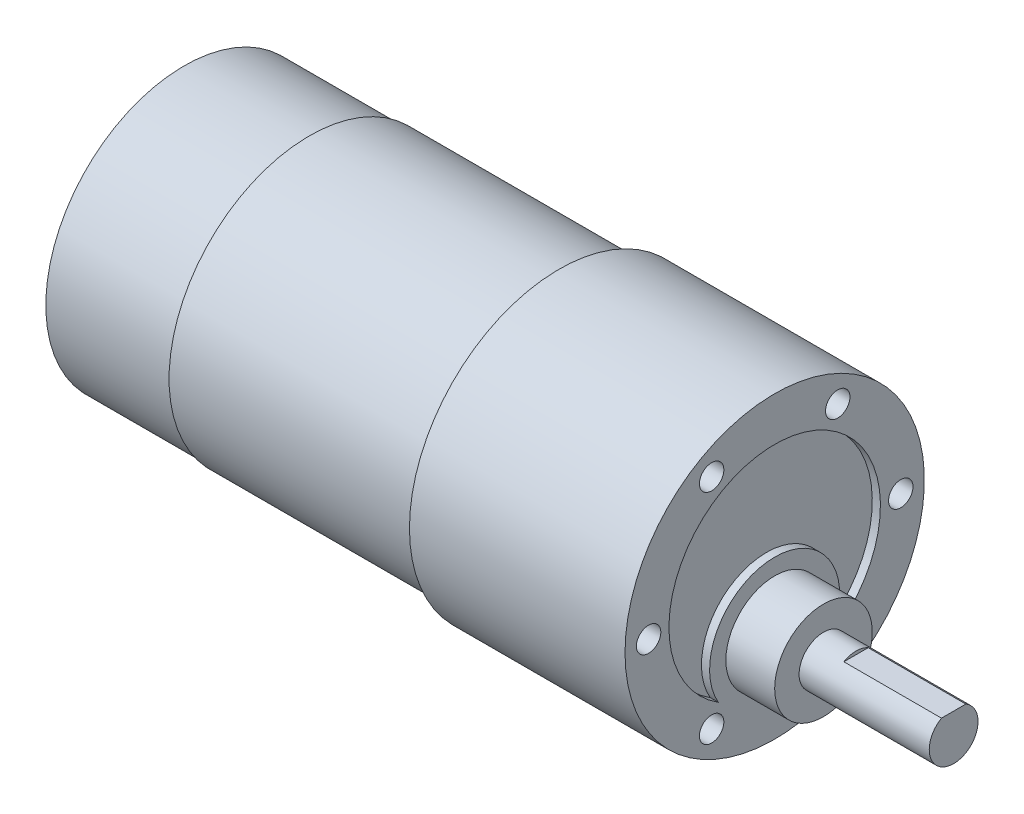
ISO-10303-21;
HEADER;
FILE_DESCRIPTION(('STEP AP214'),'2;1');
FILE_NAME('part.step','',(''),(''),'','','');
FILE_SCHEMA(('AUTOMOTIVE_DESIGN { 1 0 10303 214 1 1 1 1 }'));
ENDSEC;
DATA;
#1=APPLICATION_CONTEXT('core data for automotive mechanical design processes');
#2=APPLICATION_PROTOCOL_DEFINITION('international standard','automotive_design',2000,#1);
#3=PRODUCT_CONTEXT('',#1,'mechanical');
#4=PRODUCT('Part','Part','',(#3));
#5=PRODUCT_RELATED_PRODUCT_CATEGORY('part','',(#4));
#6=PRODUCT_DEFINITION_FORMATION('','',#4);
#7=PRODUCT_DEFINITION_CONTEXT('part definition',#1,'design');
#8=PRODUCT_DEFINITION('design','',#6,#7);
#9=PRODUCT_DEFINITION_SHAPE('','',#8);
#10=(LENGTH_UNIT() NAMED_UNIT(*) SI_UNIT(.MILLI.,.METRE.));
#11=(NAMED_UNIT(*) PLANE_ANGLE_UNIT() SI_UNIT($,.RADIAN.));
#12=(NAMED_UNIT(*) SI_UNIT($,.STERADIAN.) SOLID_ANGLE_UNIT());
#13=UNCERTAINTY_MEASURE_WITH_UNIT(LENGTH_MEASURE(1.E-05),#10,'distance_accuracy_value','');
#14=(GEOMETRIC_REPRESENTATION_CONTEXT(3) GLOBAL_UNCERTAINTY_ASSIGNED_CONTEXT((#13)) GLOBAL_UNIT_ASSIGNED_CONTEXT((#10,
#11,#12)) REPRESENTATION_CONTEXT('',''));
#15=CARTESIAN_POINT('',(0.,0.,0.));
#16=DIRECTION('',(0.,0.,1.));
#17=DIRECTION('',(1.,0.,0.));
#18=AXIS2_PLACEMENT_3D('',#15,#16,#17);
#19=CARTESIAN_POINT('',(-26.5,0.,0.));
#20=DIRECTION('',(1.,0.,0.));
#21=DIRECTION('',(0.,1.,0.));
#22=AXIS2_PLACEMENT_3D('',#19,#20,#21);
#23=PLANE('',#22);
#24=CARTESIAN_POINT('',(-26.5,0.,0.));
#25=DIRECTION('',(1.,0.,0.));
#26=DIRECTION('',(0.,0.,1.));
#27=AXIS2_PLACEMENT_3D('',#24,#25,#26);
#28=CIRCLE('',#27,17.25);
#29=CARTESIAN_POINT('',(-26.5,0.,-17.25));
#30=VERTEX_POINT('',#29);
#31=EDGE_CURVE('E207',#30,#30,#28,.T.);
#32=ORIENTED_EDGE('',*,*,#31,.T.);
#33=EDGE_LOOP('',(#32));
#34=FACE_BOUND('',#33,.T.);
#35=CARTESIAN_POINT('',(-26.5,0.,0.));
#36=DIRECTION('',(-1.,0.,0.));
#37=DIRECTION('',(0.,0.,-1.));
#38=AXIS2_PLACEMENT_3D('',#35,#36,#37);
#39=CIRCLE('',#38,18.4);
#40=CARTESIAN_POINT('',(-26.5,0.,18.4));
#41=VERTEX_POINT('',#40);
#42=EDGE_CURVE('E238',#41,#41,#39,.T.);
#43=ORIENTED_EDGE('',*,*,#42,.T.);
#44=EDGE_LOOP('',(#43));
#45=FACE_BOUND('',#44,.T.);
#46=ADVANCED_FACE('F16',(#34,#45),#23,.F.);
#47=CARTESIAN_POINT('',(0.,0.,0.));
#48=DIRECTION('',(1.,0.,0.));
#49=DIRECTION('',(0.,1.,0.));
#50=AXIS2_PLACEMENT_3D('',#47,#48,#49);
#51=PLANE('',#50);
#52=CARTESIAN_POINT('',(0.,-7.00000010430813,0.));
#53=DIRECTION('',(-1.,0.,0.));
#54=DIRECTION('',(0.,0.,-1.));
#55=AXIS2_PLACEMENT_3D('',#52,#53,#54);
#56=CIRCLE('',#55,6.);
#57=CARTESIAN_POINT('',(0.,-7.00000010430813,6.));
#58=VERTEX_POINT('',#57);
#59=EDGE_CURVE('E215',#58,#58,#56,.T.);
#60=ORIENTED_EDGE('',*,*,#59,.T.);
#61=EDGE_LOOP('',(#60));
#62=FACE_BOUND('',#61,.T.);
#63=CARTESIAN_POINT('',(0.,-13.4233937586588,7.75));
#64=DIRECTION('',(-1.,0.,0.));
#65=DIRECTION('',(0.,0.,-1.));
#66=AXIS2_PLACEMENT_3D('',#63,#64,#65);
#67=CIRCLE('',#66,1.5);
#68=CARTESIAN_POINT('',(0.,-13.4233937586588,9.25));
#69=VERTEX_POINT('',#68);
#70=EDGE_CURVE('E125',#69,#69,#67,.T.);
#71=ORIENTED_EDGE('',*,*,#70,.T.);
#72=EDGE_LOOP('',(#71));
#73=FACE_BOUND('',#72,.T.);
#74=CARTESIAN_POINT('',(0.,0.,15.5));
#75=DIRECTION('',(-1.,0.,0.));
#76=DIRECTION('',(0.,0.,-1.));
#77=AXIS2_PLACEMENT_3D('',#74,#75,#76);
#78=CIRCLE('',#77,1.5);
#79=CARTESIAN_POINT('',(0.,0.,17.));
#80=VERTEX_POINT('',#79);
#81=EDGE_CURVE('E347',#80,#80,#78,.T.);
#82=ORIENTED_EDGE('',*,*,#81,.T.);
#83=EDGE_LOOP('',(#82));
#84=FACE_BOUND('',#83,.T.);
#85=CARTESIAN_POINT('',(0.,13.4233937586588,-7.75));
#86=DIRECTION('',(-1.,0.,0.));
#87=DIRECTION('',(0.,0.,-1.));
#88=AXIS2_PLACEMENT_3D('',#85,#86,#87);
#89=CIRCLE('',#88,1.5);
#90=CARTESIAN_POINT('',(0.,13.4233937586588,-6.25));
#91=VERTEX_POINT('',#90);
#92=EDGE_CURVE('E181',#91,#91,#89,.T.);
#93=ORIENTED_EDGE('',*,*,#92,.T.);
#94=EDGE_LOOP('',(#93));
#95=FACE_BOUND('',#94,.T.);
#96=CARTESIAN_POINT('',(0.,-13.4233937586588,-7.75));
#97=DIRECTION('',(-1.,0.,0.));
#98=DIRECTION('',(0.,0.,-1.));
#99=AXIS2_PLACEMENT_3D('',#96,#97,#98);
#100=CIRCLE('',#99,1.5);
#101=CARTESIAN_POINT('',(0.,-13.4233937586588,-6.25));
#102=VERTEX_POINT('',#101);
#103=EDGE_CURVE('E162',#102,#102,#100,.T.);
#104=ORIENTED_EDGE('',*,*,#103,.T.);
#105=EDGE_LOOP('',(#104));
#106=FACE_BOUND('',#105,.T.);
#107=CARTESIAN_POINT('',(0.,13.4233937586588,7.75));
#108=DIRECTION('',(-1.,0.,0.));
#109=DIRECTION('',(0.,0.,-1.));
#110=AXIS2_PLACEMENT_3D('',#107,#108,#109);
#111=CIRCLE('',#110,1.5);
#112=CARTESIAN_POINT('',(0.,13.4233937586588,9.25));
#113=VERTEX_POINT('',#112);
#114=EDGE_CURVE('E239',#113,#113,#111,.T.);
#115=ORIENTED_EDGE('',*,*,#114,.T.);
#116=EDGE_LOOP('',(#115));
#117=FACE_BOUND('',#116,.T.);
#118=CARTESIAN_POINT('',(0.,0.,-15.5));
#119=DIRECTION('',(-1.,0.,0.));
#120=DIRECTION('',(0.,0.,-1.));
#121=AXIS2_PLACEMENT_3D('',#118,#119,#120);
#122=CIRCLE('',#121,1.5);
#123=CARTESIAN_POINT('',(0.,0.,-14.));
#124=VERTEX_POINT('',#123);
#125=EDGE_CURVE('E191',#124,#124,#122,.T.);
#126=ORIENTED_EDGE('',*,*,#125,.T.);
#127=EDGE_LOOP('',(#126));
#128=FACE_BOUND('',#127,.T.);
#129=CARTESIAN_POINT('',(0.,-7.00000010430813,0.));
#130=DIRECTION('',(1.,0.,0.));
#131=DIRECTION('',(0.,-0.499999979510904,-0.866025415613824));
#132=AXIS2_PLACEMENT_3D('',#129,#130,#131);
#133=CIRCLE('',#132,8.);
#134=CARTESIAN_POINT('',(0.,-10.9999999403954,-6.92820332491059));
#135=VERTEX_POINT('',#134);
#136=CARTESIAN_POINT('',(0.,-10.9999999403954,6.92820332491059));
#137=VERTEX_POINT('',#136);
#138=EDGE_CURVE('E168',#135,#137,#133,.T.);
#139=ORIENTED_EDGE('',*,*,#138,.T.);
#140=CARTESIAN_POINT('',(0.,0.,0.));
#141=DIRECTION('',(-1.,0.,0.));
#142=DIRECTION('',(0.,-0.846153841568874,-0.532938717300814));
#143=AXIS2_PLACEMENT_3D('',#140,#141,#142);
#144=CIRCLE('',#143,13.);
#145=EDGE_CURVE('E151',#137,#135,#144,.T.);
#146=ORIENTED_EDGE('',*,*,#145,.T.);
#147=EDGE_LOOP('',(#139,#146));
#148=FACE_BOUND('',#147,.T.);
#149=CARTESIAN_POINT('',(0.,0.,0.));
#150=DIRECTION('',(1.,0.,0.));
#151=DIRECTION('',(0.,0.,-1.));
#152=AXIS2_PLACEMENT_3D('',#149,#150,#151);
#153=CIRCLE('',#152,18.4);
#154=CARTESIAN_POINT('',(0.,0.,18.4));
#155=VERTEX_POINT('',#154);
#156=EDGE_CURVE('E11',#155,#155,#153,.T.);
#157=ORIENTED_EDGE('',*,*,#156,.T.);
#158=EDGE_LOOP('',(#157));
#159=FACE_BOUND('',#158,.T.);
#160=ADVANCED_FACE('F131',(#62,#73,#84,#95,#106,#117,#128,#148,#159),#51,.T.);
#161=CARTESIAN_POINT('',(0.,0.,0.));
#162=DIRECTION('',(-1.,0.,0.));
#163=DIRECTION('',(0.,0.,-1.));
#164=AXIS2_PLACEMENT_3D('',#161,#162,#163);
#165=CYLINDRICAL_SURFACE('',#164,18.4);
#166=ORIENTED_EDGE('',*,*,#42,.F.);
#167=DIRECTION('',(1.,0.,0.));
#168=VECTOR('',#167,1.);
#169=CARTESIAN_POINT('',(0.,0.,18.4));
#170=LINE('',#169,#168);
#171=EDGE_CURVE('E27',#41,#155,#170,.T.);
#172=ORIENTED_EDGE('',*,*,#171,.T.);
#173=ORIENTED_EDGE('',*,*,#156,.F.);
#174=ORIENTED_EDGE('',*,*,#171,.F.);
#175=EDGE_LOOP('',(#166,#172,#173,#174));
#176=FACE_BOUND('',#175,.T.);
#177=ADVANCED_FACE('F298',(#176),#165,.T.);
#178=CARTESIAN_POINT('',(-57.2,0.,0.));
#179=DIRECTION('',(-1.,0.,0.));
#180=DIRECTION('',(0.,0.,1.));
#181=AXIS2_PLACEMENT_3D('',#178,#179,#180);
#182=PLANE('',#181);
#183=CARTESIAN_POINT('',(-57.2,0.,0.));
#184=DIRECTION('',(1.,0.,0.));
#185=DIRECTION('',(0.,0.,1.));
#186=AXIS2_PLACEMENT_3D('',#183,#184,#185);
#187=CIRCLE('',#186,17.);
#188=CARTESIAN_POINT('',(-57.2,0.,-17.));
#189=VERTEX_POINT('',#188);
#190=EDGE_CURVE('E178',#189,#189,#187,.T.);
#191=ORIENTED_EDGE('',*,*,#190,.T.);
#192=EDGE_LOOP('',(#191));
#193=FACE_BOUND('',#192,.T.);
#194=CARTESIAN_POINT('',(-57.2,0.,0.));
#195=DIRECTION('',(-1.,0.,0.));
#196=DIRECTION('',(0.,0.,1.));
#197=AXIS2_PLACEMENT_3D('',#194,#195,#196);
#198=CIRCLE('',#197,17.25);
#199=CARTESIAN_POINT('',(-57.2,0.,-17.25));
#200=VERTEX_POINT('',#199);
#201=EDGE_CURVE('E208',#200,#200,#198,.T.);
#202=ORIENTED_EDGE('',*,*,#201,.T.);
#203=EDGE_LOOP('',(#202));
#204=FACE_BOUND('',#203,.T.);
#205=ADVANCED_FACE('F318',(#193,#204),#182,.T.);
#206=CARTESIAN_POINT('',(-26.5,0.,0.));
#207=DIRECTION('',(-1.,0.,0.));
#208=DIRECTION('',(0.,0.,1.));
#209=AXIS2_PLACEMENT_3D('',#206,#207,#208);
#210=CYLINDRICAL_SURFACE('',#209,17.25);
#211=ORIENTED_EDGE('',*,*,#201,.F.);
#212=DIRECTION('',(1.,0.,0.));
#213=VECTOR('',#212,1.);
#214=CARTESIAN_POINT('',(-26.5,0.,-17.25));
#215=LINE('',#214,#213);
#216=EDGE_CURVE('E203',#200,#30,#215,.T.);
#217=ORIENTED_EDGE('',*,*,#216,.T.);
#218=ORIENTED_EDGE('',*,*,#31,.F.);
#219=ORIENTED_EDGE('',*,*,#216,.F.);
#220=EDGE_LOOP('',(#211,#217,#218,#219));
#221=FACE_BOUND('',#220,.T.);
#222=ADVANCED_FACE('F321',(#221),#210,.T.);
#223=CARTESIAN_POINT('',(6.,-7.00000010430813,0.));
#224=DIRECTION('',(1.,0.,0.));
#225=DIRECTION('',(0.,1.,0.));
#226=AXIS2_PLACEMENT_3D('',#223,#224,#225);
#227=PLANE('',#226);
#228=CARTESIAN_POINT('',(6.,-7.00000010430813,0.));
#229=DIRECTION('',(-1.,0.,0.));
#230=DIRECTION('',(0.,0.,-1.));
#231=AXIS2_PLACEMENT_3D('',#228,#229,#230);
#232=CIRCLE('',#231,3.00000004470348);
#233=CARTESIAN_POINT('',(6.,-7.00000010430813,3.00000004470348));
#234=VERTEX_POINT('',#233);
#235=EDGE_CURVE('E173',#234,#234,#232,.T.);
#236=ORIENTED_EDGE('',*,*,#235,.T.);
#237=EDGE_LOOP('',(#236));
#238=FACE_BOUND('',#237,.T.);
#239=CARTESIAN_POINT('',(6.,-7.00000010430813,0.));
#240=DIRECTION('',(1.,0.,0.));
#241=DIRECTION('',(0.,0.,-1.));
#242=AXIS2_PLACEMENT_3D('',#239,#240,#241);
#243=CIRCLE('',#242,6.);
#244=CARTESIAN_POINT('',(6.,-7.00000010430813,6.));
#245=VERTEX_POINT('',#244);
#246=EDGE_CURVE('E216',#245,#245,#243,.T.);
#247=ORIENTED_EDGE('',*,*,#246,.T.);
#248=EDGE_LOOP('',(#247));
#249=FACE_BOUND('',#248,.T.);
#250=ADVANCED_FACE('F491',(#238,#249),#227,.T.);
#251=CARTESIAN_POINT('',(0.,-7.00000010430813,0.));
#252=DIRECTION('',(1.,0.,0.));
#253=DIRECTION('',(0.,0.,-1.));
#254=AXIS2_PLACEMENT_3D('',#251,#252,#253);
#255=CYLINDRICAL_SURFACE('',#254,6.);
#256=ORIENTED_EDGE('',*,*,#246,.F.);
#257=DIRECTION('',(-1.,0.,0.));
#258=VECTOR('',#257,1.);
#259=CARTESIAN_POINT('',(0.,-7.00000010430813,6.));
#260=LINE('',#259,#258);
#261=EDGE_CURVE('E212',#245,#58,#260,.T.);
#262=ORIENTED_EDGE('',*,*,#261,.T.);
#263=ORIENTED_EDGE('',*,*,#59,.F.);
#264=ORIENTED_EDGE('',*,*,#261,.F.);
#265=EDGE_LOOP('',(#256,#262,#263,#264));
#266=FACE_BOUND('',#265,.T.);
#267=ADVANCED_FACE('F311',(#266),#255,.T.);
#268=CARTESIAN_POINT('',(6.,-7.00000010430813,0.));
#269=DIRECTION('',(1.,0.,0.));
#270=DIRECTION('',(0.,0.,-1.));
#271=AXIS2_PLACEMENT_3D('',#268,#269,#270);
#272=CYLINDRICAL_SURFACE('',#271,3.00000004470348);
#273=DIRECTION('',(1.,0.,0.));
#274=VECTOR('',#273,1.);
#275=CARTESIAN_POINT('',(6.,-4.40000010430813,-1.49666304431589));
#276=LINE('',#275,#274);
#277=CARTESIAN_POINT('',(10.,-4.40000010430813,-1.49666304431589));
#278=VERTEX_POINT('',#277);
#279=CARTESIAN_POINT('',(22.,-4.40000010430813,-1.49666304431589));
#280=VERTEX_POINT('',#279);
#281=EDGE_CURVE('E144',#278,#280,#276,.T.);
#282=ORIENTED_EDGE('',*,*,#281,.T.);
#283=CARTESIAN_POINT('',(22.,-7.00000010430813,0.));
#284=DIRECTION('',(1.,0.,0.));
#285=DIRECTION('',(0.,0.,-1.));
#286=AXIS2_PLACEMENT_3D('',#283,#284,#285);
#287=CIRCLE('',#286,3.00000004470348);
#288=CARTESIAN_POINT('',(22.,-7.00000010430813,3.00000004470348));
#289=VERTEX_POINT('',#288);
#290=EDGE_CURVE('E174',#289,#280,#287,.T.);
#291=ORIENTED_EDGE('',*,*,#290,.F.);
#292=DIRECTION('',(-1.,0.,0.));
#293=VECTOR('',#292,1.);
#294=CARTESIAN_POINT('',(6.,-7.00000010430813,3.00000004470348));
#295=LINE('',#294,#293);
#296=EDGE_CURVE('E169',#289,#234,#295,.T.);
#297=ORIENTED_EDGE('',*,*,#296,.T.);
#298=ORIENTED_EDGE('',*,*,#235,.F.);
#299=ORIENTED_EDGE('',*,*,#296,.F.);
#300=CARTESIAN_POINT('',(22.,-7.00000010430813,0.));
#301=DIRECTION('',(1.,0.,0.));
#302=DIRECTION('',(0.,0.,-1.));
#303=AXIS2_PLACEMENT_3D('',#300,#301,#302);
#304=CIRCLE('',#303,3.00000004470348);
#305=CARTESIAN_POINT('',(22.,-4.40000010430813,1.49666304431589));
#306=VERTEX_POINT('',#305);
#307=EDGE_CURVE('E219',#306,#289,#304,.T.);
#308=ORIENTED_EDGE('',*,*,#307,.F.);
#309=DIRECTION('',(-1.,0.,0.));
#310=VECTOR('',#309,1.);
#311=CARTESIAN_POINT('',(6.,-4.40000010430813,1.49666304431589));
#312=LINE('',#311,#310);
#313=CARTESIAN_POINT('',(10.,-4.40000010430813,1.49666304431589));
#314=VERTEX_POINT('',#313);
#315=EDGE_CURVE('E146',#306,#314,#312,.T.);
#316=ORIENTED_EDGE('',*,*,#315,.T.);
#317=CARTESIAN_POINT('',(10.,-7.00000010430813,0.));
#318=DIRECTION('',(-1.,0.,0.));
#319=DIRECTION('',(0.,0.,-1.));
#320=AXIS2_PLACEMENT_3D('',#317,#318,#319);
#321=CIRCLE('',#320,3.00000004470348);
#322=EDGE_CURVE('E20',#314,#278,#321,.T.);
#323=ORIENTED_EDGE('',*,*,#322,.T.);
#324=EDGE_LOOP('',(#282,#291,#297,#298,#299,#308,#316,#323));
#325=FACE_BOUND('',#324,.T.);
#326=ADVANCED_FACE('F307',(#325),#272,.T.);
#327=CARTESIAN_POINT('',(22.,-7.00000010430813,0.));
#328=DIRECTION('',(1.,0.,0.));
#329=DIRECTION('',(0.,1.,0.));
#330=AXIS2_PLACEMENT_3D('',#327,#328,#329);
#331=PLANE('',#330);
#332=DIRECTION('',(0.,0.,1.));
#333=VECTOR('',#332,1.);
#334=CARTESIAN_POINT('',(22.,-4.40000010430813,-0.748331522157944));
#335=LINE('',#334,#333);
#336=EDGE_CURVE('E251',#280,#306,#335,.T.);
#337=ORIENTED_EDGE('',*,*,#336,.T.);
#338=ORIENTED_EDGE('',*,*,#307,.T.);
#339=ORIENTED_EDGE('',*,*,#290,.T.);
#340=EDGE_LOOP('',(#337,#338,#339));
#341=FACE_BOUND('',#340,.T.);
#342=ADVANCED_FACE('F310',(#341),#331,.T.);
#343=CARTESIAN_POINT('',(10.,-4.20000008195639,0.));
#344=DIRECTION('',(1.,0.,0.));
#345=DIRECTION('',(0.,1.,0.));
#346=AXIS2_PLACEMENT_3D('',#343,#344,#345);
#347=PLANE('',#346);
#348=DIRECTION('',(0.,0.,1.));
#349=VECTOR('',#348,1.);
#350=CARTESIAN_POINT('',(10.,-4.40000010430813,-1.49666304431589));
#351=LINE('',#350,#349);
#352=EDGE_CURVE('E150',#278,#314,#351,.T.);
#353=ORIENTED_EDGE('',*,*,#352,.F.);
#354=ORIENTED_EDGE('',*,*,#322,.F.);
#355=EDGE_LOOP('',(#353,#354));
#356=FACE_BOUND('',#355,.T.);
#357=ADVANCED_FACE('F478',(#356),#347,.T.);
#358=CARTESIAN_POINT('',(22.,-4.40000010430813,-1.49666304431589));
#359=DIRECTION('',(0.,-1.,0.));
#360=DIRECTION('',(0.,0.,-1.));
#361=AXIS2_PLACEMENT_3D('',#358,#359,#360);
#362=PLANE('',#361);
#363=ORIENTED_EDGE('',*,*,#336,.F.);
#364=ORIENTED_EDGE('',*,*,#281,.F.);
#365=ORIENTED_EDGE('',*,*,#352,.T.);
#366=ORIENTED_EDGE('',*,*,#315,.F.);
#367=EDGE_LOOP('',(#363,#364,#365,#366));
#368=FACE_BOUND('',#367,.T.);
#369=ADVANCED_FACE('F472',(#368),#362,.F.);
#370=CARTESIAN_POINT('',(-8.,-13.4233937586588,7.75));
#371=DIRECTION('',(1.,0.,0.));
#372=DIRECTION('',(0.,1.,0.));
#373=AXIS2_PLACEMENT_3D('',#370,#371,#372);
#374=PLANE('',#373);
#375=CARTESIAN_POINT('',(-8.,-13.4233937586588,7.75));
#376=DIRECTION('',(-1.,0.,0.));
#377=DIRECTION('',(0.,0.,-1.));
#378=AXIS2_PLACEMENT_3D('',#375,#376,#377);
#379=CIRCLE('',#378,1.5);
#380=CARTESIAN_POINT('',(-8.,-13.4233937586588,9.25));
#381=VERTEX_POINT('',#380);
#382=EDGE_CURVE('E127',#381,#381,#379,.T.);
#383=ORIENTED_EDGE('',*,*,#382,.F.);
#384=EDGE_LOOP('',(#383));
#385=FACE_BOUND('',#384,.T.);
#386=ADVANCED_FACE('F477',(#385),#374,.T.);
#387=CARTESIAN_POINT('',(0.,-13.4233937586588,7.75));
#388=DIRECTION('',(-1.,0.,0.));
#389=DIRECTION('',(0.,0.,-1.));
#390=AXIS2_PLACEMENT_3D('',#387,#388,#389);
#391=CYLINDRICAL_SURFACE('',#390,1.5);
#392=ORIENTED_EDGE('',*,*,#70,.F.);
#393=DIRECTION('',(-1.,0.,0.));
#394=VECTOR('',#393,1.);
#395=CARTESIAN_POINT('',(0.,-13.4233937586588,9.25));
#396=LINE('',#395,#394);
#397=EDGE_CURVE('E122',#69,#381,#396,.T.);
#398=ORIENTED_EDGE('',*,*,#397,.T.);
#399=ORIENTED_EDGE('',*,*,#382,.T.);
#400=ORIENTED_EDGE('',*,*,#397,.F.);
#401=EDGE_LOOP('',(#392,#398,#399,#400));
#402=FACE_BOUND('',#401,.T.);
#403=ADVANCED_FACE('F124',(#402),#391,.F.);
#404=CARTESIAN_POINT('',(-8.,0.,15.5));
#405=DIRECTION('',(1.,0.,0.));
#406=DIRECTION('',(0.,1.,0.));
#407=AXIS2_PLACEMENT_3D('',#404,#405,#406);
#408=PLANE('',#407);
#409=CARTESIAN_POINT('',(-8.,0.,15.5));
#410=DIRECTION('',(-1.,0.,0.));
#411=DIRECTION('',(0.,0.,-1.));
#412=AXIS2_PLACEMENT_3D('',#409,#410,#411);
#413=CIRCLE('',#412,1.5);
#414=CARTESIAN_POINT('',(-8.,0.,17.));
#415=VERTEX_POINT('',#414);
#416=EDGE_CURVE('E134',#415,#415,#413,.T.);
#417=ORIENTED_EDGE('',*,*,#416,.F.);
#418=EDGE_LOOP('',(#417));
#419=FACE_BOUND('',#418,.T.);
#420=ADVANCED_FACE('F640',(#419),#408,.T.);
#421=CARTESIAN_POINT('',(0.,0.,15.5));
#422=DIRECTION('',(-1.,0.,0.));
#423=DIRECTION('',(0.,0.,-1.));
#424=AXIS2_PLACEMENT_3D('',#421,#422,#423);
#425=CYLINDRICAL_SURFACE('',#424,1.5);
#426=ORIENTED_EDGE('',*,*,#81,.F.);
#427=DIRECTION('',(-1.,0.,0.));
#428=VECTOR('',#427,1.);
#429=CARTESIAN_POINT('',(0.,0.,17.));
#430=LINE('',#429,#428);
#431=EDGE_CURVE('E140',#80,#415,#430,.T.);
#432=ORIENTED_EDGE('',*,*,#431,.T.);
#433=ORIENTED_EDGE('',*,*,#416,.T.);
#434=ORIENTED_EDGE('',*,*,#431,.F.);
#435=EDGE_LOOP('',(#426,#432,#433,#434));
#436=FACE_BOUND('',#435,.T.);
#437=ADVANCED_FACE('F463',(#436),#425,.F.);
#438=CARTESIAN_POINT('',(-8.,13.4233937586588,-7.75));
#439=DIRECTION('',(1.,0.,0.));
#440=DIRECTION('',(0.,1.,0.));
#441=AXIS2_PLACEMENT_3D('',#438,#439,#440);
#442=PLANE('',#441);
#443=CARTESIAN_POINT('',(-8.,13.4233937586588,-7.75));
#444=DIRECTION('',(-1.,0.,0.));
#445=DIRECTION('',(0.,0.,-1.));
#446=AXIS2_PLACEMENT_3D('',#443,#444,#445);
#447=CIRCLE('',#446,1.5);
#448=CARTESIAN_POINT('',(-8.,13.4233937586588,-6.25));
#449=VERTEX_POINT('',#448);
#450=EDGE_CURVE('E199',#449,#449,#447,.T.);
#451=ORIENTED_EDGE('',*,*,#450,.F.);
#452=EDGE_LOOP('',(#451));
#453=FACE_BOUND('',#452,.T.);
#454=ADVANCED_FACE('F457',(#453),#442,.T.);
#455=CARTESIAN_POINT('',(0.,13.4233937586588,-7.75));
#456=DIRECTION('',(-1.,0.,0.));
#457=DIRECTION('',(0.,0.,-1.));
#458=AXIS2_PLACEMENT_3D('',#455,#456,#457);
#459=CYLINDRICAL_SURFACE('',#458,1.5);
#460=ORIENTED_EDGE('',*,*,#92,.F.);
#461=DIRECTION('',(-1.,0.,0.));
#462=VECTOR('',#461,1.);
#463=CARTESIAN_POINT('',(0.,13.4233937586588,-6.25));
#464=LINE('',#463,#462);
#465=EDGE_CURVE('E195',#91,#449,#464,.T.);
#466=ORIENTED_EDGE('',*,*,#465,.T.);
#467=ORIENTED_EDGE('',*,*,#450,.T.);
#468=ORIENTED_EDGE('',*,*,#465,.F.);
#469=EDGE_LOOP('',(#460,#466,#467,#468));
#470=FACE_BOUND('',#469,.T.);
#471=ADVANCED_FACE('F462',(#470),#459,.F.);
#472=CARTESIAN_POINT('',(-8.,-13.4233937586588,-7.75));
#473=DIRECTION('',(1.,0.,0.));
#474=DIRECTION('',(0.,1.,0.));
#475=AXIS2_PLACEMENT_3D('',#472,#473,#474);
#476=PLANE('',#475);
#477=CARTESIAN_POINT('',(-8.,-13.4233937586588,-7.75));
#478=DIRECTION('',(-1.,0.,0.));
#479=DIRECTION('',(0.,0.,-1.));
#480=AXIS2_PLACEMENT_3D('',#477,#478,#479);
#481=CIRCLE('',#480,1.5);
#482=CARTESIAN_POINT('',(-8.,-13.4233937586588,-6.25));
#483=VERTEX_POINT('',#482);
#484=EDGE_CURVE('E161',#483,#483,#481,.T.);
#485=ORIENTED_EDGE('',*,*,#484,.F.);
#486=EDGE_LOOP('',(#485));
#487=FACE_BOUND('',#486,.T.);
#488=ADVANCED_FACE('F661',(#487),#476,.T.);
#489=CARTESIAN_POINT('',(0.,-13.4233937586588,-7.75));
#490=DIRECTION('',(-1.,0.,0.));
#491=DIRECTION('',(0.,0.,-1.));
#492=AXIS2_PLACEMENT_3D('',#489,#490,#491);
#493=CYLINDRICAL_SURFACE('',#492,1.5);
#494=ORIENTED_EDGE('',*,*,#103,.F.);
#495=DIRECTION('',(-1.,0.,0.));
#496=VECTOR('',#495,1.);
#497=CARTESIAN_POINT('',(0.,-13.4233937586588,-6.25));
#498=LINE('',#497,#496);
#499=EDGE_CURVE('E157',#102,#483,#498,.T.);
#500=ORIENTED_EDGE('',*,*,#499,.T.);
#501=ORIENTED_EDGE('',*,*,#484,.T.);
#502=ORIENTED_EDGE('',*,*,#499,.F.);
#503=EDGE_LOOP('',(#494,#500,#501,#502));
#504=FACE_BOUND('',#503,.T.);
#505=ADVANCED_FACE('F669',(#504),#493,.F.);
#506=CARTESIAN_POINT('',(-8.,13.4233937586588,7.75));
#507=DIRECTION('',(1.,0.,0.));
#508=DIRECTION('',(0.,1.,0.));
#509=AXIS2_PLACEMENT_3D('',#506,#507,#508);
#510=PLANE('',#509);
#511=CARTESIAN_POINT('',(-8.,13.4233937586588,7.75));
#512=DIRECTION('',(-1.,0.,0.));
#513=DIRECTION('',(0.,0.,-1.));
#514=AXIS2_PLACEMENT_3D('',#511,#512,#513);
#515=CIRCLE('',#514,1.5);
#516=CARTESIAN_POINT('',(-8.,13.4233937586588,9.25));
#517=VERTEX_POINT('',#516);
#518=EDGE_CURVE('E182',#517,#517,#515,.T.);
#519=ORIENTED_EDGE('',*,*,#518,.F.);
#520=EDGE_LOOP('',(#519));
#521=FACE_BOUND('',#520,.T.);
#522=ADVANCED_FACE('F287',(#521),#510,.T.);
#523=CARTESIAN_POINT('',(0.,13.4233937586588,7.75));
#524=DIRECTION('',(-1.,0.,0.));
#525=DIRECTION('',(0.,0.,-1.));
#526=AXIS2_PLACEMENT_3D('',#523,#524,#525);
#527=CYLINDRICAL_SURFACE('',#526,1.5);
#528=ORIENTED_EDGE('',*,*,#114,.F.);
#529=DIRECTION('',(-1.,0.,0.));
#530=VECTOR('',#529,1.);
#531=CARTESIAN_POINT('',(0.,13.4233937586588,9.25));
#532=LINE('',#531,#530);
#533=EDGE_CURVE('E185',#113,#517,#532,.T.);
#534=ORIENTED_EDGE('',*,*,#533,.T.);
#535=ORIENTED_EDGE('',*,*,#518,.T.);
#536=ORIENTED_EDGE('',*,*,#533,.F.);
#537=EDGE_LOOP('',(#528,#534,#535,#536));
#538=FACE_BOUND('',#537,.T.);
#539=ADVANCED_FACE('F279',(#538),#527,.F.);
#540=CARTESIAN_POINT('',(-8.,0.,-15.5));
#541=DIRECTION('',(1.,0.,0.));
#542=DIRECTION('',(0.,1.,0.));
#543=AXIS2_PLACEMENT_3D('',#540,#541,#542);
#544=PLANE('',#543);
#545=CARTESIAN_POINT('',(-8.,0.,-15.5));
#546=DIRECTION('',(-1.,0.,0.));
#547=DIRECTION('',(0.,0.,-1.));
#548=AXIS2_PLACEMENT_3D('',#545,#546,#547);
#549=CIRCLE('',#548,1.5);
#550=CARTESIAN_POINT('',(-8.,0.,-14.));
#551=VERTEX_POINT('',#550);
#552=EDGE_CURVE('E190',#551,#551,#549,.T.);
#553=ORIENTED_EDGE('',*,*,#552,.F.);
#554=EDGE_LOOP('',(#553));
#555=FACE_BOUND('',#554,.T.);
#556=ADVANCED_FACE('F277',(#555),#544,.T.);
#557=CARTESIAN_POINT('',(0.,0.,-15.5));
#558=DIRECTION('',(-1.,0.,0.));
#559=DIRECTION('',(0.,0.,-1.));
#560=AXIS2_PLACEMENT_3D('',#557,#558,#559);
#561=CYLINDRICAL_SURFACE('',#560,1.5);
#562=ORIENTED_EDGE('',*,*,#125,.F.);
#563=DIRECTION('',(-1.,0.,0.));
#564=VECTOR('',#563,1.);
#565=CARTESIAN_POINT('',(0.,0.,-14.));
#566=LINE('',#565,#564);
#567=EDGE_CURVE('E186',#124,#551,#566,.T.);
#568=ORIENTED_EDGE('',*,*,#567,.T.);
#569=ORIENTED_EDGE('',*,*,#552,.T.);
#570=ORIENTED_EDGE('',*,*,#567,.F.);
#571=EDGE_LOOP('',(#562,#568,#569,#570));
#572=FACE_BOUND('',#571,.T.);
#573=ADVANCED_FACE('F18',(#572),#561,.F.);
#574=CARTESIAN_POINT('',(-1.,1.00000002980232,0.));
#575=DIRECTION('',(1.,0.,0.));
#576=DIRECTION('',(0.,1.,0.));
#577=AXIS2_PLACEMENT_3D('',#574,#575,#576);
#578=PLANE('',#577);
#579=CARTESIAN_POINT('',(-1.,0.,0.));
#580=DIRECTION('',(-1.,0.,0.));
#581=DIRECTION('',(0.,-0.846153841568874,-0.532938717300814));
#582=AXIS2_PLACEMENT_3D('',#579,#580,#581);
#583=CIRCLE('',#582,13.);
#584=CARTESIAN_POINT('',(-1.,-10.9999999403954,6.92820332491059));
#585=VERTEX_POINT('',#584);
#586=CARTESIAN_POINT('',(-1.,-10.9999999403954,-6.92820332491059));
#587=VERTEX_POINT('',#586);
#588=EDGE_CURVE('E155',#585,#587,#583,.T.);
#589=ORIENTED_EDGE('',*,*,#588,.F.);
#590=CARTESIAN_POINT('',(-1.,-7.00000010430813,0.));
#591=DIRECTION('',(1.,0.,0.));
#592=DIRECTION('',(0.,-0.499999979510904,-0.866025415613824));
#593=AXIS2_PLACEMENT_3D('',#590,#591,#592);
#594=CIRCLE('',#593,8.);
#595=EDGE_CURVE('E167',#587,#585,#594,.T.);
#596=ORIENTED_EDGE('',*,*,#595,.F.);
#597=EDGE_LOOP('',(#589,#596));
#598=FACE_BOUND('',#597,.T.);
#599=ADVANCED_FACE('F286',(#598),#578,.T.);
#600=CARTESIAN_POINT('',(0.,0.,0.));
#601=DIRECTION('',(-1.,0.,0.));
#602=DIRECTION('',(0.,1.,0.));
#603=AXIS2_PLACEMENT_3D('',#600,#601,#602);
#604=CYLINDRICAL_SURFACE('',#603,13.);
#605=ORIENTED_EDGE('',*,*,#145,.F.);
#606=DIRECTION('',(-1.,0.,0.));
#607=VECTOR('',#606,1.);
#608=CARTESIAN_POINT('',(0.,-10.9999999403954,6.92820332491059));
#609=LINE('',#608,#607);
#610=EDGE_CURVE('E156',#137,#585,#609,.T.);
#611=ORIENTED_EDGE('',*,*,#610,.T.);
#612=ORIENTED_EDGE('',*,*,#588,.T.);
#613=DIRECTION('',(-1.,0.,0.));
#614=VECTOR('',#613,1.);
#615=CARTESIAN_POINT('',(0.,-10.9999999403954,-6.92820332491059));
#616=LINE('',#615,#614);
#617=EDGE_CURVE('E163',#135,#587,#616,.T.);
#618=ORIENTED_EDGE('',*,*,#617,.F.);
#619=EDGE_LOOP('',(#605,#611,#612,#618));
#620=FACE_BOUND('',#619,.T.);
#621=ADVANCED_FACE('F305',(#620),#604,.F.);
#622=CARTESIAN_POINT('',(0.,-7.00000010430813,0.));
#623=DIRECTION('',(-1.,0.,0.));
#624=DIRECTION('',(0.,1.,0.));
#625=AXIS2_PLACEMENT_3D('',#622,#623,#624);
#626=CYLINDRICAL_SURFACE('',#625,8.);
#627=ORIENTED_EDGE('',*,*,#138,.F.);
#628=ORIENTED_EDGE('',*,*,#617,.T.);
#629=ORIENTED_EDGE('',*,*,#595,.T.);
#630=ORIENTED_EDGE('',*,*,#610,.F.);
#631=EDGE_LOOP('',(#627,#628,#629,#630));
#632=FACE_BOUND('',#631,.T.);
#633=ADVANCED_FACE('F313',(#632),#626,.T.);
#634=CARTESIAN_POINT('',(-72.6,0.,0.));
#635=DIRECTION('',(-1.,0.,0.));
#636=DIRECTION('',(0.,0.,1.));
#637=AXIS2_PLACEMENT_3D('',#634,#635,#636);
#638=PLANE('',#637);
#639=CARTESIAN_POINT('',(-72.6,0.,0.));
#640=DIRECTION('',(-1.,0.,0.));
#641=DIRECTION('',(0.,0.,1.));
#642=AXIS2_PLACEMENT_3D('',#639,#640,#641);
#643=CIRCLE('',#642,17.);
#644=CARTESIAN_POINT('',(-72.6,0.,-17.));
#645=VERTEX_POINT('',#644);
#646=EDGE_CURVE('E234',#645,#645,#643,.T.);
#647=ORIENTED_EDGE('',*,*,#646,.T.);
#648=EDGE_LOOP('',(#647));
#649=FACE_BOUND('',#648,.T.);
#650=ADVANCED_FACE('F316',(#649),#638,.T.);
#651=CARTESIAN_POINT('',(-57.2,0.,0.));
#652=DIRECTION('',(-1.,0.,0.));
#653=DIRECTION('',(0.,0.,1.));
#654=AXIS2_PLACEMENT_3D('',#651,#652,#653);
#655=CYLINDRICAL_SURFACE('',#654,17.);
#656=ORIENTED_EDGE('',*,*,#646,.F.);
#657=DIRECTION('',(1.,0.,0.));
#658=VECTOR('',#657,1.);
#659=CARTESIAN_POINT('',(-57.2,0.,-17.));
#660=LINE('',#659,#658);
#661=EDGE_CURVE('E211',#645,#189,#660,.T.);
#662=ORIENTED_EDGE('',*,*,#661,.T.);
#663=ORIENTED_EDGE('',*,*,#190,.F.);
#664=ORIENTED_EDGE('',*,*,#661,.F.);
#665=EDGE_LOOP('',(#656,#662,#663,#664));
#666=FACE_BOUND('',#665,.T.);
#667=ADVANCED_FACE('F326',(#666),#655,.T.);
#668=CLOSED_SHELL('',(#46,#160,#177,#205,#222,#250,#267,#326,#342,#357,#369,#386,#403,#420,#437,
#454,#471,#488,#505,#522,#539,#556,#573,#599,#621,#633,#650,#667));
#669=MANIFOLD_SOLID_BREP('B1',#668);
#670=ADVANCED_BREP_SHAPE_REPRESENTATION('',(#18,#669),#14);
#671=SHAPE_DEFINITION_REPRESENTATION(#9,#670);
ENDSEC;
END-ISO-10303-21;
